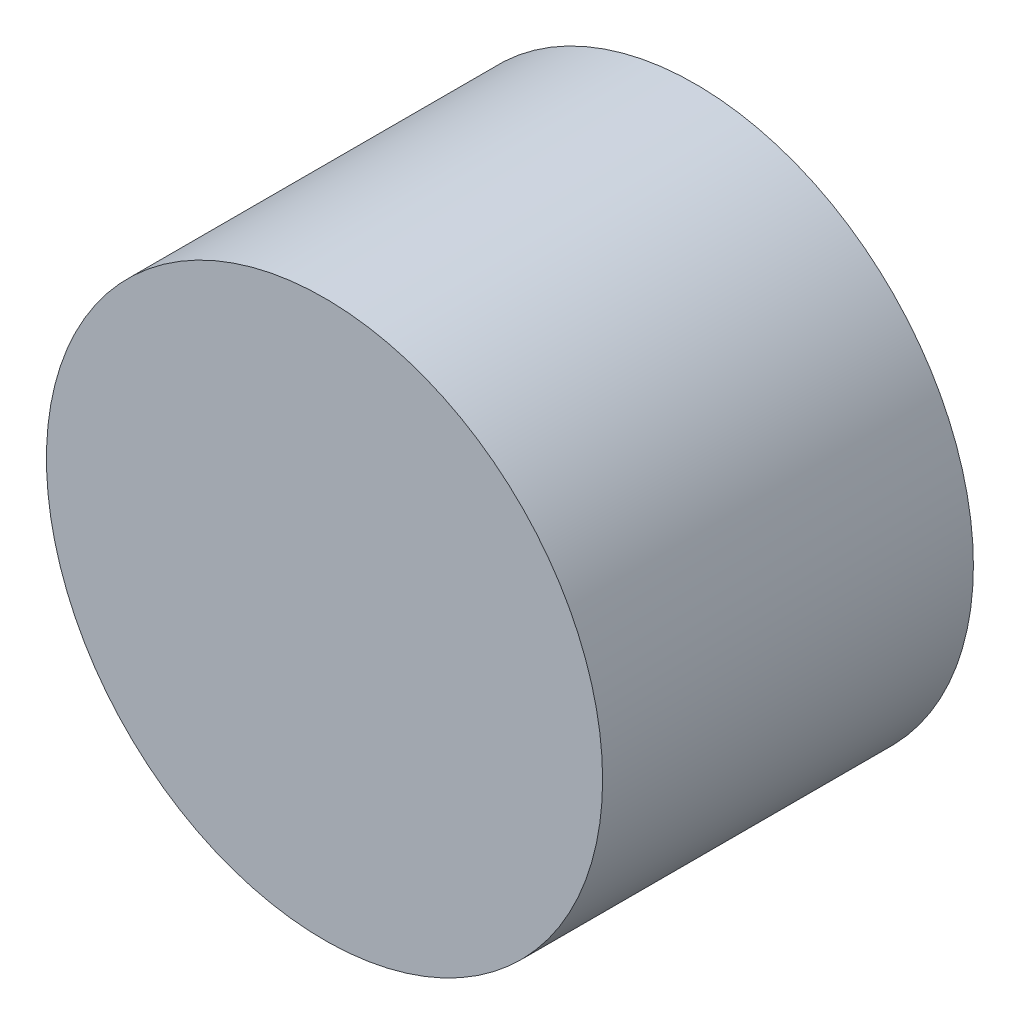
ISO-10303-21;
HEADER;
FILE_DESCRIPTION(('STEP AP214'),'2;1');
FILE_NAME('part.step','',(''),(''),'','','');
FILE_SCHEMA(('AUTOMOTIVE_DESIGN { 1 0 10303 214 1 1 1 1 }'));
ENDSEC;
DATA;
#1=APPLICATION_CONTEXT('core data for automotive mechanical design processes');
#2=APPLICATION_PROTOCOL_DEFINITION('international standard','automotive_design',2000,#1);
#3=PRODUCT_CONTEXT('',#1,'mechanical');
#4=PRODUCT('Part','Part','',(#3));
#5=PRODUCT_RELATED_PRODUCT_CATEGORY('part','',(#4));
#6=PRODUCT_DEFINITION_FORMATION('','',#4);
#7=PRODUCT_DEFINITION_CONTEXT('part definition',#1,'design');
#8=PRODUCT_DEFINITION('design','',#6,#7);
#9=PRODUCT_DEFINITION_SHAPE('','',#8);
#10=(LENGTH_UNIT() NAMED_UNIT(*) SI_UNIT(.MILLI.,.METRE.));
#11=(NAMED_UNIT(*) PLANE_ANGLE_UNIT() SI_UNIT($,.RADIAN.));
#12=(NAMED_UNIT(*) SI_UNIT($,.STERADIAN.) SOLID_ANGLE_UNIT());
#13=UNCERTAINTY_MEASURE_WITH_UNIT(LENGTH_MEASURE(1.E-05),#10,'distance_accuracy_value','');
#14=(GEOMETRIC_REPRESENTATION_CONTEXT(3) GLOBAL_UNCERTAINTY_ASSIGNED_CONTEXT((#13)) GLOBAL_UNIT_ASSIGNED_CONTEXT((#10,
#11,#12)) REPRESENTATION_CONTEXT('',''));
#15=CARTESIAN_POINT('',(0.,0.,0.));
#16=DIRECTION('',(0.,0.,1.));
#17=DIRECTION('',(1.,0.,0.));
#18=AXIS2_PLACEMENT_3D('',#15,#16,#17);
#19=CARTESIAN_POINT('',(0.,0.,10.));
#20=DIRECTION('',(0.,0.,-1.));
#21=DIRECTION('',(-1.,0.,0.));
#22=AXIS2_PLACEMENT_3D('',#19,#20,#21);
#23=CYLINDRICAL_SURFACE('',#22,7.5);
#24=CARTESIAN_POINT('',(0.,0.,10.));
#25=DIRECTION('',(0.,0.,1.));
#26=DIRECTION('',(1.,0.,0.));
#27=AXIS2_PLACEMENT_3D('',#24,#25,#26);
#28=CIRCLE('',#27,7.5);
#29=CARTESIAN_POINT('',(7.5,0.,10.));
#30=VERTEX_POINT('',#29);
#31=EDGE_CURVE('E11',#30,#30,#28,.T.);
#32=ORIENTED_EDGE('',*,*,#31,.F.);
#33=EDGE_LOOP('',(#32));
#34=FACE_BOUND('',#33,.T.);
#35=CARTESIAN_POINT('',(0.,0.,0.));
#36=DIRECTION('',(0.,0.,1.));
#37=DIRECTION('',(1.,0.,0.));
#38=AXIS2_PLACEMENT_3D('',#35,#36,#37);
#39=CIRCLE('',#38,7.5);
#40=CARTESIAN_POINT('',(7.5,0.,0.));
#41=VERTEX_POINT('',#40);
#42=EDGE_CURVE('E35',#41,#41,#39,.T.);
#43=ORIENTED_EDGE('',*,*,#42,.T.);
#44=EDGE_LOOP('',(#43));
#45=FACE_BOUND('',#44,.T.);
#46=ADVANCED_FACE('F32',(#34,#45),#23,.T.);
#47=CARTESIAN_POINT('',(0.,0.,10.));
#48=DIRECTION('',(0.,0.,1.));
#49=DIRECTION('',(1.,0.,0.));
#50=AXIS2_PLACEMENT_3D('',#47,#48,#49);
#51=PLANE('',#50);
#52=ORIENTED_EDGE('',*,*,#31,.T.);
#53=EDGE_LOOP('',(#52));
#54=FACE_BOUND('',#53,.T.);
#55=ADVANCED_FACE('F57',(#54),#51,.T.);
#56=CARTESIAN_POINT('',(0.,0.,0.));
#57=DIRECTION('',(0.,0.,1.));
#58=DIRECTION('',(1.,0.,0.));
#59=AXIS2_PLACEMENT_3D('',#56,#57,#58);
#60=PLANE('',#59);
#61=CARTESIAN_POINT('',(0.,0.,0.));
#62=DIRECTION('',(0.,0.,-1.));
#63=DIRECTION('',(-1.,0.,0.));
#64=AXIS2_PLACEMENT_3D('',#61,#62,#63);
#65=CIRCLE('',#64,3.);
#66=CARTESIAN_POINT('',(-3.,0.,0.));
#67=VERTEX_POINT('',#66);
#68=EDGE_CURVE('E46',#67,#67,#65,.T.);
#69=ORIENTED_EDGE('',*,*,#68,.F.);
#70=EDGE_LOOP('',(#69));
#71=FACE_BOUND('',#70,.T.);
#72=ORIENTED_EDGE('',*,*,#42,.F.);
#73=EDGE_LOOP('',(#72));
#74=FACE_BOUND('',#73,.T.);
#75=ADVANCED_FACE('F53',(#71,#74),#60,.F.);
#76=CARTESIAN_POINT('',(0.,0.,9.8));
#77=DIRECTION('',(0.,0.,1.));
#78=DIRECTION('',(1.,0.,0.));
#79=AXIS2_PLACEMENT_3D('',#76,#77,#78);
#80=PLANE('',#79);
#81=CARTESIAN_POINT('',(0.,0.,9.8));
#82=DIRECTION('',(0.,0.,1.));
#83=DIRECTION('',(1.,0.,0.));
#84=AXIS2_PLACEMENT_3D('',#81,#82,#83);
#85=CIRCLE('',#84,3.);
#86=CARTESIAN_POINT('',(3.,0.,9.8));
#87=VERTEX_POINT('',#86);
#88=EDGE_CURVE('E42',#87,#87,#85,.F.);
#89=ORIENTED_EDGE('',*,*,#88,.T.);
#90=EDGE_LOOP('',(#89));
#91=FACE_BOUND('',#90,.T.);
#92=ADVANCED_FACE('F56',(#91),#80,.F.);
#93=CARTESIAN_POINT('',(0.,0.,18.4852813742386));
#94=DIRECTION('',(0.,0.,-1.));
#95=DIRECTION('',(-1.,0.,0.));
#96=AXIS2_PLACEMENT_3D('',#93,#94,#95);
#97=CYLINDRICAL_SURFACE('',#96,3.);
#98=ORIENTED_EDGE('',*,*,#68,.T.);
#99=EDGE_LOOP('',(#98));
#100=FACE_BOUND('',#99,.T.);
#101=ORIENTED_EDGE('',*,*,#88,.F.);
#102=EDGE_LOOP('',(#101));
#103=FACE_BOUND('',#102,.T.);
#104=ADVANCED_FACE('F50',(#100,#103),#97,.F.);
#105=CLOSED_SHELL('',(#46,#55,#75,#92,#104));
#106=MANIFOLD_SOLID_BREP('B2',#105);
#107=ADVANCED_BREP_SHAPE_REPRESENTATION('',(#18,#106),#14);
#108=SHAPE_DEFINITION_REPRESENTATION(#9,#107);
ENDSEC;
END-ISO-10303-21;
